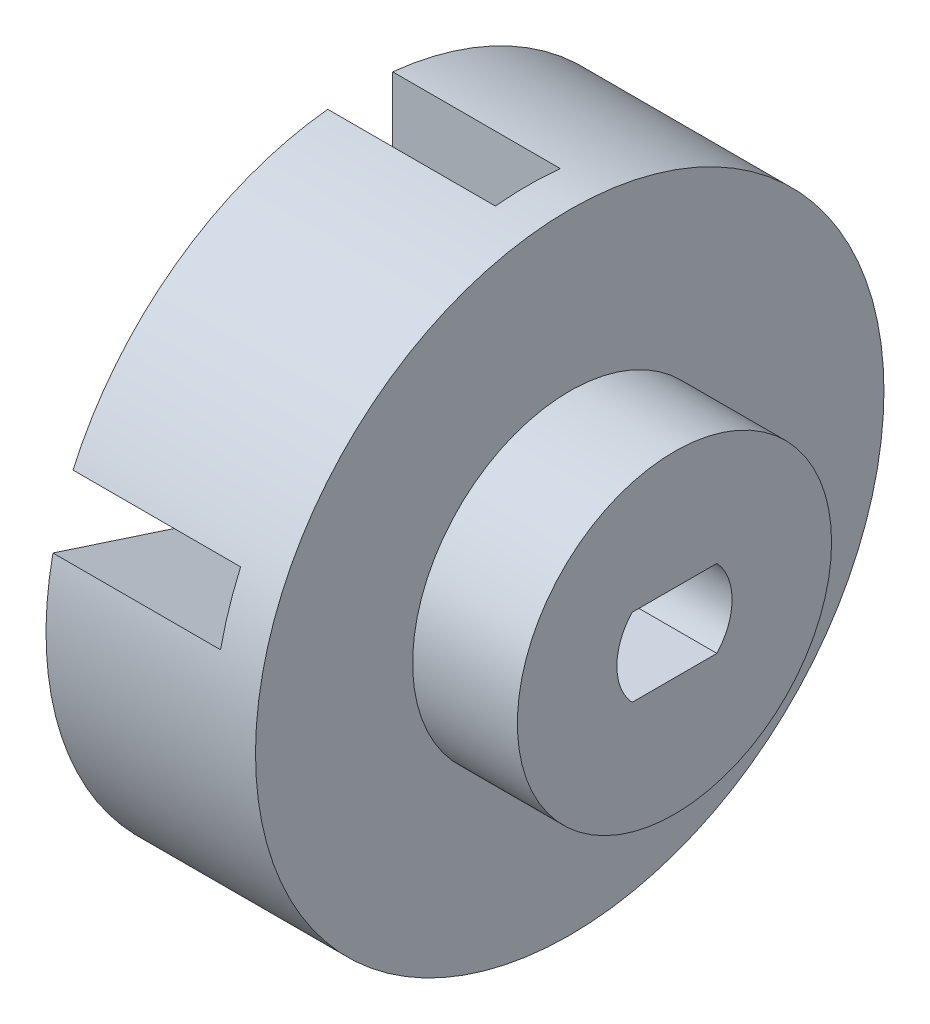
ISO-10303-21;
HEADER;
FILE_DESCRIPTION(('STEP AP214'),'2;1');
FILE_NAME('part.step','',(''),(''),'','','');
FILE_SCHEMA(('AUTOMOTIVE_DESIGN { 1 0 10303 214 1 1 1 1 }'));
ENDSEC;
DATA;
#1=APPLICATION_CONTEXT('core data for automotive mechanical design processes');
#2=APPLICATION_PROTOCOL_DEFINITION('international standard','automotive_design',2000,#1);
#3=PRODUCT_CONTEXT('',#1,'mechanical');
#4=PRODUCT('Part','Part','',(#3));
#5=PRODUCT_RELATED_PRODUCT_CATEGORY('part','',(#4));
#6=PRODUCT_DEFINITION_FORMATION('','',#4);
#7=PRODUCT_DEFINITION_CONTEXT('part definition',#1,'design');
#8=PRODUCT_DEFINITION('design','',#6,#7);
#9=PRODUCT_DEFINITION_SHAPE('','',#8);
#10=(LENGTH_UNIT() NAMED_UNIT(*) SI_UNIT(.MILLI.,.METRE.));
#11=(NAMED_UNIT(*) PLANE_ANGLE_UNIT() SI_UNIT($,.RADIAN.));
#12=(NAMED_UNIT(*) SI_UNIT($,.STERADIAN.) SOLID_ANGLE_UNIT());
#13=UNCERTAINTY_MEASURE_WITH_UNIT(LENGTH_MEASURE(1.E-05),#10,'distance_accuracy_value','');
#14=(GEOMETRIC_REPRESENTATION_CONTEXT(3) GLOBAL_UNCERTAINTY_ASSIGNED_CONTEXT((#13)) GLOBAL_UNIT_ASSIGNED_CONTEXT((#10,
#11,#12)) REPRESENTATION_CONTEXT('',''));
#15=CARTESIAN_POINT('',(0.,0.,0.));
#16=DIRECTION('',(0.,0.,1.));
#17=DIRECTION('',(1.,0.,0.));
#18=AXIS2_PLACEMENT_3D('',#15,#16,#17);
#19=CARTESIAN_POINT('',(10.,0.,0.));
#20=DIRECTION('',(-1.,0.,0.));
#21=DIRECTION('',(0.,0.,1.));
#22=AXIS2_PLACEMENT_3D('',#19,#20,#21);
#23=CYLINDRICAL_SURFACE('',#22,15.);
#24=CARTESIAN_POINT('',(0.,0.,0.));
#25=DIRECTION('',(1.,0.,0.));
#26=DIRECTION('',(0.,0.,-1.));
#27=AXIS2_PLACEMENT_3D('',#24,#25,#26);
#28=CIRCLE('',#27,15.);
#29=CARTESIAN_POINT('',(0.,-11.1592251173272,-10.023556992446));
#30=VERTEX_POINT('',#29);
#31=CARTESIAN_POINT('',(0.,3.1363037882978,-14.6684559019519));
#32=VERTEX_POINT('',#31);
#33=EDGE_CURVE('E374',#30,#32,#28,.T.);
#34=ORIENTED_EDGE('',*,*,#33,.T.);
#35=DIRECTION('',(-1.,0.,0.));
#36=VECTOR('',#35,1.);
#37=CARTESIAN_POINT('',(10.,3.1363037882978,-14.6684559019519));
#38=LINE('',#37,#36);
#39=CARTESIAN_POINT('',(8.,3.1363037882978,-14.6684559019519));
#40=VERTEX_POINT('',#39);
#41=EDGE_CURVE('E326',#32,#40,#38,.F.);
#42=ORIENTED_EDGE('',*,*,#41,.T.);
#43=CARTESIAN_POINT('',(8.,0.,0.));
#44=DIRECTION('',(1.,0.,0.));
#45=DIRECTION('',(0.,0.,-1.));
#46=AXIS2_PLACEMENT_3D('',#43,#44,#45);
#47=CIRCLE('',#46,15.);
#48=CARTESIAN_POINT('',(8.,6.08457898881283,-13.7105032193898));
#49=VERTEX_POINT('',#48);
#50=EDGE_CURVE('E11',#40,#49,#47,.T.);
#51=ORIENTED_EDGE('',*,*,#50,.T.);
#52=DIRECTION('',(-1.,0.,0.));
#53=VECTOR('',#52,1.);
#54=CARTESIAN_POINT('',(10.,6.08457898881283,-13.7105032193898));
#55=LINE('',#54,#53);
#56=CARTESIAN_POINT('',(0.,6.08457898881283,-13.7105032193898));
#57=VERTEX_POINT('',#56);
#58=EDGE_CURVE('E323',#49,#57,#55,.T.);
#59=ORIENTED_EDGE('',*,*,#58,.T.);
#60=CARTESIAN_POINT('',(0.,14.9197017396461,-1.55));
#61=VERTEX_POINT('',#60);
#62=EDGE_CURVE('E381',#57,#61,#28,.T.);
#63=ORIENTED_EDGE('',*,*,#62,.T.);
#64=DIRECTION('',(-1.,0.,0.));
#65=VECTOR('',#64,1.);
#66=CARTESIAN_POINT('',(10.,14.9197017396461,-1.55));
#67=LINE('',#66,#65);
#68=CARTESIAN_POINT('',(8.,14.9197017396461,-1.55));
#69=VERTEX_POINT('',#68);
#70=EDGE_CURVE('E299',#61,#69,#67,.F.);
#71=ORIENTED_EDGE('',*,*,#70,.T.);
#72=CARTESIAN_POINT('',(8.,0.,0.));
#73=DIRECTION('',(-1.,0.,0.));
#74=DIRECTION('',(0.,0.,1.));
#75=AXIS2_PLACEMENT_3D('',#72,#73,#74);
#76=CIRCLE('',#75,15.);
#77=CARTESIAN_POINT('',(8.,14.9197017396461,1.55));
#78=VERTEX_POINT('',#77);
#79=EDGE_CURVE('E397',#78,#69,#76,.T.);
#80=ORIENTED_EDGE('',*,*,#79,.F.);
#81=DIRECTION('',(-1.,0.,0.));
#82=VECTOR('',#81,1.);
#83=CARTESIAN_POINT('',(10.,14.9197017396461,1.55));
#84=LINE('',#83,#82);
#85=CARTESIAN_POINT('',(0.,14.9197017396461,1.55));
#86=VERTEX_POINT('',#85);
#87=EDGE_CURVE('E304',#78,#86,#84,.T.);
#88=ORIENTED_EDGE('',*,*,#87,.T.);
#89=CARTESIAN_POINT('',(0.,6.08457898881418,13.7105032193892));
#90=VERTEX_POINT('',#89);
#91=EDGE_CURVE('E435',#86,#90,#28,.T.);
#92=ORIENTED_EDGE('',*,*,#91,.T.);
#93=DIRECTION('',(-1.,0.,0.));
#94=VECTOR('',#93,1.);
#95=CARTESIAN_POINT('',(10.,6.08457898881418,13.7105032193892));
#96=LINE('',#95,#94);
#97=CARTESIAN_POINT('',(8.,6.08457898881418,13.7105032193892));
#98=VERTEX_POINT('',#97);
#99=EDGE_CURVE('E206',#90,#98,#96,.F.);
#100=ORIENTED_EDGE('',*,*,#99,.T.);
#101=CARTESIAN_POINT('',(8.,0.,0.));
#102=DIRECTION('',(1.,0.,0.));
#103=DIRECTION('',(0.,0.,-1.));
#104=AXIS2_PLACEMENT_3D('',#101,#102,#103);
#105=CIRCLE('',#104,15.);
#106=CARTESIAN_POINT('',(8.,3.13630378829924,14.6684559019516));
#107=VERTEX_POINT('',#106);
#108=EDGE_CURVE('E399',#98,#107,#105,.T.);
#109=ORIENTED_EDGE('',*,*,#108,.T.);
#110=DIRECTION('',(-1.,0.,0.));
#111=VECTOR('',#110,1.);
#112=CARTESIAN_POINT('',(10.,3.13630378829924,14.6684559019516));
#113=LINE('',#112,#111);
#114=CARTESIAN_POINT('',(0.,3.13630378829924,14.6684559019516));
#115=VERTEX_POINT('',#114);
#116=EDGE_CURVE('E307',#107,#115,#113,.T.);
#117=ORIENTED_EDGE('',*,*,#116,.T.);
#118=CARTESIAN_POINT('',(0.,-11.1592251173246,10.0235569924489));
#119=VERTEX_POINT('',#118);
#120=EDGE_CURVE('E436',#115,#119,#28,.T.);
#121=ORIENTED_EDGE('',*,*,#120,.T.);
#122=DIRECTION('',(-1.,0.,0.));
#123=VECTOR('',#122,1.);
#124=CARTESIAN_POINT('',(10.,-11.1592251173246,10.0235569924489));
#125=LINE('',#124,#123);
#126=CARTESIAN_POINT('',(8.,-11.1592251173246,10.0235569924489));
#127=VERTEX_POINT('',#126);
#128=EDGE_CURVE('E314',#119,#127,#125,.F.);
#129=ORIENTED_EDGE('',*,*,#128,.T.);
#130=CARTESIAN_POINT('',(8.,0.,0.));
#131=DIRECTION('',(1.,0.,0.));
#132=DIRECTION('',(0.,0.,-1.));
#133=AXIS2_PLACEMENT_3D('',#130,#131,#132);
#134=CIRCLE('',#133,15.);
#135=CARTESIAN_POINT('',(8.,-12.9813593994316,7.5156043098868));
#136=VERTEX_POINT('',#135);
#137=EDGE_CURVE('E402',#127,#136,#134,.T.);
#138=ORIENTED_EDGE('',*,*,#137,.T.);
#139=DIRECTION('',(-1.,0.,0.));
#140=VECTOR('',#139,1.);
#141=CARTESIAN_POINT('',(10.,-12.9813593994316,7.5156043098868));
#142=LINE('',#141,#140);
#143=CARTESIAN_POINT('',(0.,-12.9813593994316,7.5156043098868));
#144=VERTEX_POINT('',#143);
#145=EDGE_CURVE('E311',#136,#144,#142,.T.);
#146=ORIENTED_EDGE('',*,*,#145,.T.);
#147=CARTESIAN_POINT('',(0.,-12.9813593994335,-7.51560430988345));
#148=VERTEX_POINT('',#147);
#149=EDGE_CURVE('E384',#144,#148,#28,.T.);
#150=ORIENTED_EDGE('',*,*,#149,.T.);
#151=DIRECTION('',(-1.,0.,0.));
#152=VECTOR('',#151,1.);
#153=CARTESIAN_POINT('',(10.,-12.9813593994335,-7.51560430988345));
#154=LINE('',#153,#152);
#155=CARTESIAN_POINT('',(8.,-12.9813593994335,-7.51560430988345));
#156=VERTEX_POINT('',#155);
#157=EDGE_CURVE('E320',#148,#156,#154,.F.);
#158=ORIENTED_EDGE('',*,*,#157,.T.);
#159=CARTESIAN_POINT('',(8.,0.,0.));
#160=DIRECTION('',(1.,0.,0.));
#161=DIRECTION('',(0.,0.,-1.));
#162=AXIS2_PLACEMENT_3D('',#159,#160,#161);
#163=CIRCLE('',#162,15.);
#164=CARTESIAN_POINT('',(8.,-11.1592251173272,-10.023556992446));
#165=VERTEX_POINT('',#164);
#166=EDGE_CURVE('E44',#156,#165,#163,.T.);
#167=ORIENTED_EDGE('',*,*,#166,.T.);
#168=DIRECTION('',(-1.,0.,0.));
#169=VECTOR('',#168,1.);
#170=CARTESIAN_POINT('',(10.,-11.1592251173272,-10.023556992446));
#171=LINE('',#170,#169);
#172=EDGE_CURVE('E317',#165,#30,#171,.T.);
#173=ORIENTED_EDGE('',*,*,#172,.T.);
#174=EDGE_LOOP('',(#34,#42,#51,#59,#63,#71,#80,#88,#92,#100,#109,#117,#121,#129,#138,#146,#150,
#158,#167,#173));
#175=FACE_BOUND('',#174,.T.);
#176=CARTESIAN_POINT('',(10.,0.,0.));
#177=DIRECTION('',(1.,0.,0.));
#178=DIRECTION('',(0.,0.,-1.));
#179=AXIS2_PLACEMENT_3D('',#176,#177,#178);
#180=CIRCLE('',#179,15.);
#181=CARTESIAN_POINT('',(10.,0.,-15.));
#182=VERTEX_POINT('',#181);
#183=EDGE_CURVE('E378',#182,#182,#180,.T.);
#184=ORIENTED_EDGE('',*,*,#183,.F.);
#185=EDGE_LOOP('',(#184));
#186=FACE_BOUND('',#185,.T.);
#187=ADVANCED_FACE('F37',(#175,#186),#23,.T.);
#188=CARTESIAN_POINT('',(10.,0.,0.));
#189=DIRECTION('',(1.,0.,0.));
#190=DIRECTION('',(0.,0.,-1.));
#191=AXIS2_PLACEMENT_3D('',#188,#189,#190);
#192=PLANE('',#191);
#193=CARTESIAN_POINT('',(10.,0.,0.));
#194=DIRECTION('',(1.,0.,0.));
#195=DIRECTION('',(0.,0.,-1.));
#196=AXIS2_PLACEMENT_3D('',#193,#194,#195);
#197=CIRCLE('',#196,7.5);
#198=CARTESIAN_POINT('',(10.,0.,-7.5));
#199=VERTEX_POINT('',#198);
#200=EDGE_CURVE('E375',#199,#199,#197,.T.);
#201=ORIENTED_EDGE('',*,*,#200,.F.);
#202=EDGE_LOOP('',(#201));
#203=FACE_BOUND('',#202,.T.);
#204=ORIENTED_EDGE('',*,*,#183,.T.);
#205=EDGE_LOOP('',(#204));
#206=FACE_BOUND('',#205,.T.);
#207=ADVANCED_FACE('F464',(#203,#206),#192,.T.);
#208=CARTESIAN_POINT('',(0.,0.,0.));
#209=DIRECTION('',(1.,0.,0.));
#210=DIRECTION('',(0.,0.,-1.));
#211=AXIS2_PLACEMENT_3D('',#208,#209,#210);
#212=PLANE('',#211);
#213=CARTESIAN_POINT('',(0.,0.,0.));
#214=DIRECTION('',(-1.,0.,0.));
#215=DIRECTION('',(0.,0.,1.));
#216=AXIS2_PLACEMENT_3D('',#213,#214,#215);
#217=CIRCLE('',#216,2.7);
#218=CARTESIAN_POINT('',(0.,0.,2.7));
#219=VERTEX_POINT('',#218);
#220=EDGE_CURVE('E337',#219,#219,#217,.T.);
#221=ORIENTED_EDGE('',*,*,#220,.F.);
#222=EDGE_LOOP('',(#221));
#223=FACE_BOUND('',#222,.T.);
#224=DIRECTION('',(0.,0.951056516295154,0.309016994374947));
#225=VECTOR('',#224,1.);
#226=CARTESIAN_POINT('',(0.,0.0709473716161586,-5.23425892275631));
#227=LINE('',#226,#225);
#228=CARTESIAN_POINT('',(0.,0.0709473716161586,-5.23425892275631));
#229=VERTEX_POINT('',#228);
#230=CARTESIAN_POINT('',(0.,3.01922257213113,-4.27630624019398));
#231=VERTEX_POINT('',#230);
#232=EDGE_CURVE('E51',#229,#231,#227,.T.);
#233=ORIENTED_EDGE('',*,*,#232,.F.);
#234=DIRECTION('',(0.,0.309016994374947,-0.951056516295154));
#235=VECTOR('',#234,1.);
#236=CARTESIAN_POINT('',(0.,-1.47413760025829,-0.478976341281428));
#237=LINE('',#236,#235);
#238=EDGE_CURVE('E394',#229,#32,#237,.T.);
#239=ORIENTED_EDGE('',*,*,#238,.T.);
#240=ORIENTED_EDGE('',*,*,#33,.F.);
#241=DIRECTION('',(0.,-0.809016994374948,-0.587785252292473));
#242=VECTOR('',#241,1.);
#243=CARTESIAN_POINT('',(0.,-15.2620026854318,-13.0043993786205));
#244=LINE('',#243,#242);
#245=CARTESIAN_POINT('',(0.,-3.13401783082224,-4.19290260274169));
#246=VERTEX_POINT('',#245);
#247=EDGE_CURVE('E261',#246,#30,#244,.T.);
#248=ORIENTED_EDGE('',*,*,#247,.F.);
#249=DIRECTION('',(0.,0.587785252292473,-0.809016994374947));
#250=VECTOR('',#249,1.);
#251=CARTESIAN_POINT('',(0.,-4.95615211292891,-1.68494992017935));
#252=LINE('',#251,#250);
#253=CARTESIAN_POINT('',(0.,-4.95615211292891,-1.68494992017935));
#254=VERTEX_POINT('',#253);
#255=EDGE_CURVE('E59',#254,#246,#252,.T.);
#256=ORIENTED_EDGE('',*,*,#255,.F.);
#257=DIRECTION('',(0.,-0.809016994374948,-0.587785252292473));
#258=VECTOR('',#257,1.);
#259=CARTESIAN_POINT('',(0.,-0.911067141054503,1.25397634128278));
#260=LINE('',#259,#258);
#261=EDGE_CURVE('E391',#254,#148,#260,.T.);
#262=ORIENTED_EDGE('',*,*,#261,.T.);
#263=ORIENTED_EDGE('',*,*,#149,.F.);
#264=DIRECTION('',(0.,-0.809016994374947,0.587785252292473));
#265=VECTOR('',#264,1.);
#266=CARTESIAN_POINT('',(0.,-17.0841369675372,10.496446696062));
#267=LINE('',#266,#265);
#268=CARTESIAN_POINT('',(0.,-4.95615211292767,1.68494992018319));
#269=VERTEX_POINT('',#268);
#270=EDGE_CURVE('E246',#269,#144,#267,.T.);
#271=ORIENTED_EDGE('',*,*,#270,.F.);
#272=DIRECTION('',(0.,-0.587785252292473,-0.809016994374947));
#273=VECTOR('',#272,1.);
#274=CARTESIAN_POINT('',(0.,-3.134017830821,4.19290260274553));
#275=LINE('',#274,#273);
#276=CARTESIAN_POINT('',(0.,-3.134017830821,4.19290260274553));
#277=VERTEX_POINT('',#276);
#278=EDGE_CURVE('E221',#277,#269,#275,.T.);
#279=ORIENTED_EDGE('',*,*,#278,.F.);
#280=DIRECTION('',(0.,-0.809016994374947,0.587785252292473));
#281=VECTOR('',#280,1.);
#282=CARTESIAN_POINT('',(0.,0.911067141054419,1.25397634128266));
#283=LINE('',#282,#281);
#284=EDGE_CURVE('E211',#277,#119,#283,.T.);
#285=ORIENTED_EDGE('',*,*,#284,.T.);
#286=ORIENTED_EDGE('',*,*,#120,.F.);
#287=DIRECTION('',(0.,0.309016994374948,0.951056516295154));
#288=VECTOR('',#287,1.);
#289=CARTESIAN_POINT('',(0.,4.70342537103509,19.4915601978898));
#290=LINE('',#289,#288);
#291=CARTESIAN_POINT('',(0.,0.070947371618174,5.23425892275779));
#292=VERTEX_POINT('',#291);
#293=EDGE_CURVE('E226',#292,#115,#290,.T.);
#294=ORIENTED_EDGE('',*,*,#293,.F.);
#295=DIRECTION('',(0.,-0.951056516295154,0.309016994374947));
#296=VECTOR('',#295,1.);
#297=CARTESIAN_POINT('',(0.,3.01922257213315,4.27630624019545));
#298=LINE('',#297,#296);
#299=CARTESIAN_POINT('',(0.,3.01922257213315,4.27630624019545));
#300=VERTEX_POINT('',#299);
#301=EDGE_CURVE('E216',#300,#292,#298,.T.);
#302=ORIENTED_EDGE('',*,*,#301,.F.);
#303=DIRECTION('',(0.,0.309016994374948,0.951056516295154));
#304=VECTOR('',#303,1.);
#305=CARTESIAN_POINT('',(0.,1.47413760025807,-0.478976341281359));
#306=LINE('',#305,#304);
#307=EDGE_CURVE('E199',#300,#90,#306,.T.);
#308=ORIENTED_EDGE('',*,*,#307,.T.);
#309=ORIENTED_EDGE('',*,*,#91,.F.);
#310=DIRECTION('',(0.,1.,0.));
#311=VECTOR('',#310,1.);
#312=CARTESIAN_POINT('',(0.,19.9910137103853,1.55));
#313=LINE('',#312,#311);
#314=CARTESIAN_POINT('',(0.,5.,1.55));
#315=VERTEX_POINT('',#314);
#316=EDGE_CURVE('E227',#315,#86,#313,.T.);
#317=ORIENTED_EDGE('',*,*,#316,.F.);
#318=DIRECTION('',(0.,0.,1.));
#319=VECTOR('',#318,1.);
#320=CARTESIAN_POINT('',(0.,5.,-1.55));
#321=LINE('',#320,#319);
#322=CARTESIAN_POINT('',(0.,5.,-1.55));
#323=VERTEX_POINT('',#322);
#324=EDGE_CURVE('E229',#323,#315,#321,.T.);
#325=ORIENTED_EDGE('',*,*,#324,.F.);
#326=DIRECTION('',(0.,1.,0.));
#327=VECTOR('',#326,1.);
#328=CARTESIAN_POINT('',(0.,0.,-1.54999999999999));
#329=LINE('',#328,#327);
#330=EDGE_CURVE('E212',#323,#61,#329,.T.);
#331=ORIENTED_EDGE('',*,*,#330,.T.);
#332=ORIENTED_EDGE('',*,*,#62,.F.);
#333=DIRECTION('',(0.,0.309016994374947,-0.951056516295154));
#334=VECTOR('',#333,1.);
#335=CARTESIAN_POINT('',(0.,7.65170057154804,-18.533607515326));
#336=LINE('',#335,#334);
#337=EDGE_CURVE('E276',#231,#57,#336,.T.);
#338=ORIENTED_EDGE('',*,*,#337,.F.);
#339=EDGE_LOOP('',(#233,#239,#240,#248,#256,#262,#263,#271,#279,#285,#286,#294,#302,#308,#309,
#317,#325,#331,#332,#338));
#340=FACE_BOUND('',#339,.T.);
#341=ADVANCED_FACE('F224',(#223,#340),#212,.F.);
#342=CARTESIAN_POINT('',(15.,0.,0.));
#343=DIRECTION('',(-1.,0.,0.));
#344=DIRECTION('',(0.,0.,1.));
#345=AXIS2_PLACEMENT_3D('',#342,#343,#344);
#346=CYLINDRICAL_SURFACE('',#345,7.5);
#347=CARTESIAN_POINT('',(15.,0.,0.));
#348=DIRECTION('',(1.,0.,0.));
#349=DIRECTION('',(0.,0.,-1.));
#350=AXIS2_PLACEMENT_3D('',#347,#348,#349);
#351=CIRCLE('',#350,7.5);
#352=CARTESIAN_POINT('',(15.,0.,-7.5));
#353=VERTEX_POINT('',#352);
#354=EDGE_CURVE('E365',#353,#353,#351,.T.);
#355=ORIENTED_EDGE('',*,*,#354,.F.);
#356=EDGE_LOOP('',(#355));
#357=FACE_BOUND('',#356,.T.);
#358=ORIENTED_EDGE('',*,*,#200,.T.);
#359=EDGE_LOOP('',(#358));
#360=FACE_BOUND('',#359,.T.);
#361=ADVANCED_FACE('F473',(#357,#360),#346,.T.);
#362=CARTESIAN_POINT('',(15.,0.,0.));
#363=DIRECTION('',(1.,0.,0.));
#364=DIRECTION('',(0.,0.,-1.));
#365=AXIS2_PLACEMENT_3D('',#362,#363,#364);
#366=PLANE('',#365);
#367=CARTESIAN_POINT('',(15.,0.,0.));
#368=DIRECTION('',(1.,0.,0.));
#369=DIRECTION('',(0.,0.,-1.));
#370=AXIS2_PLACEMENT_3D('',#367,#368,#369);
#371=CIRCLE('',#370,2.75);
#372=CARTESIAN_POINT('',(15.,1.86,2.02556165050585));
#373=VERTEX_POINT('',#372);
#374=CARTESIAN_POINT('',(15.,-1.86,2.02556165050585));
#375=VERTEX_POINT('',#374);
#376=EDGE_CURVE('E336',#373,#375,#371,.T.);
#377=ORIENTED_EDGE('',*,*,#376,.F.);
#378=DIRECTION('',(0.,0.,1.));
#379=VECTOR('',#378,1.);
#380=CARTESIAN_POINT('',(15.,1.86,2.02556165050585));
#381=LINE('',#380,#379);
#382=CARTESIAN_POINT('',(15.,1.86,-2.02556165050585));
#383=VERTEX_POINT('',#382);
#384=EDGE_CURVE('E344',#383,#373,#381,.T.);
#385=ORIENTED_EDGE('',*,*,#384,.F.);
#386=CARTESIAN_POINT('',(15.,0.,0.));
#387=DIRECTION('',(1.,0.,0.));
#388=DIRECTION('',(0.,0.,-1.));
#389=AXIS2_PLACEMENT_3D('',#386,#387,#388);
#390=CIRCLE('',#389,2.75);
#391=CARTESIAN_POINT('',(15.,-1.86,-2.02556165050585));
#392=VERTEX_POINT('',#391);
#393=EDGE_CURVE('E358',#392,#383,#390,.T.);
#394=ORIENTED_EDGE('',*,*,#393,.F.);
#395=DIRECTION('',(0.,0.,-1.));
#396=VECTOR('',#395,1.);
#397=CARTESIAN_POINT('',(15.,-1.86,2.02556165050585));
#398=LINE('',#397,#396);
#399=EDGE_CURVE('E355',#375,#392,#398,.T.);
#400=ORIENTED_EDGE('',*,*,#399,.F.);
#401=EDGE_LOOP('',(#377,#385,#394,#400));
#402=FACE_BOUND('',#401,.T.);
#403=ORIENTED_EDGE('',*,*,#354,.T.);
#404=EDGE_LOOP('',(#403));
#405=FACE_BOUND('',#404,.T.);
#406=ADVANCED_FACE('F480',(#402,#405),#366,.T.);
#407=CARTESIAN_POINT('',(10.,0.,0.));
#408=DIRECTION('',(1.,0.,0.));
#409=DIRECTION('',(0.,0.,-1.));
#410=AXIS2_PLACEMENT_3D('',#407,#408,#409);
#411=CYLINDRICAL_SURFACE('',#410,2.75);
#412=ORIENTED_EDGE('',*,*,#376,.T.);
#413=DIRECTION('',(1.,0.,0.));
#414=VECTOR('',#413,1.);
#415=CARTESIAN_POINT('',(10.,-1.86,2.02556165050585));
#416=LINE('',#415,#414);
#417=CARTESIAN_POINT('',(10.,-1.86,2.02556165050585));
#418=VERTEX_POINT('',#417);
#419=EDGE_CURVE('E353',#418,#375,#416,.T.);
#420=ORIENTED_EDGE('',*,*,#419,.F.);
#421=CARTESIAN_POINT('',(10.,0.,0.));
#422=DIRECTION('',(1.,0.,0.));
#423=DIRECTION('',(0.,0.,-1.));
#424=AXIS2_PLACEMENT_3D('',#421,#422,#423);
#425=CIRCLE('',#424,2.75);
#426=CARTESIAN_POINT('',(10.,1.86,2.02556165050585));
#427=VERTEX_POINT('',#426);
#428=EDGE_CURVE('E340',#427,#418,#425,.T.);
#429=ORIENTED_EDGE('',*,*,#428,.F.);
#430=DIRECTION('',(1.,0.,0.));
#431=VECTOR('',#430,1.);
#432=CARTESIAN_POINT('',(10.,1.86,2.02556165050585));
#433=LINE('',#432,#431);
#434=EDGE_CURVE('E363',#427,#373,#433,.T.);
#435=ORIENTED_EDGE('',*,*,#434,.T.);
#436=EDGE_LOOP('',(#412,#420,#429,#435));
#437=FACE_BOUND('',#436,.T.);
#438=ADVANCED_FACE('F484',(#437),#411,.F.);
#439=CARTESIAN_POINT('',(10.,1.86,2.02556165050585));
#440=DIRECTION('',(0.,1.,0.));
#441=DIRECTION('',(0.,0.,1.));
#442=AXIS2_PLACEMENT_3D('',#439,#440,#441);
#443=PLANE('',#442);
#444=ORIENTED_EDGE('',*,*,#384,.T.);
#445=ORIENTED_EDGE('',*,*,#434,.F.);
#446=DIRECTION('',(0.,0.,1.));
#447=VECTOR('',#446,1.);
#448=CARTESIAN_POINT('',(10.,1.86,2.02556165050585));
#449=LINE('',#448,#447);
#450=CARTESIAN_POINT('',(10.,1.86,-2.02556165050585));
#451=VERTEX_POINT('',#450);
#452=EDGE_CURVE('E350',#451,#427,#449,.T.);
#453=ORIENTED_EDGE('',*,*,#452,.F.);
#454=DIRECTION('',(1.,0.,0.));
#455=VECTOR('',#454,1.);
#456=CARTESIAN_POINT('',(10.,1.86,-2.02556165050585));
#457=LINE('',#456,#455);
#458=EDGE_CURVE('E366',#451,#383,#457,.T.);
#459=ORIENTED_EDGE('',*,*,#458,.T.);
#460=EDGE_LOOP('',(#444,#445,#453,#459));
#461=FACE_BOUND('',#460,.T.);
#462=ADVANCED_FACE('F488',(#461),#443,.F.);
#463=CARTESIAN_POINT('',(10.,0.,0.));
#464=DIRECTION('',(1.,0.,0.));
#465=DIRECTION('',(0.,0.,-1.));
#466=AXIS2_PLACEMENT_3D('',#463,#464,#465);
#467=CYLINDRICAL_SURFACE('',#466,2.75);
#468=ORIENTED_EDGE('',*,*,#393,.T.);
#469=ORIENTED_EDGE('',*,*,#458,.F.);
#470=CARTESIAN_POINT('',(10.,0.,0.));
#471=DIRECTION('',(1.,0.,0.));
#472=DIRECTION('',(0.,0.,-1.));
#473=AXIS2_PLACEMENT_3D('',#470,#471,#472);
#474=CIRCLE('',#473,2.75);
#475=CARTESIAN_POINT('',(10.,-1.86,-2.02556165050585));
#476=VERTEX_POINT('',#475);
#477=EDGE_CURVE('E347',#476,#451,#474,.T.);
#478=ORIENTED_EDGE('',*,*,#477,.F.);
#479=DIRECTION('',(1.,0.,0.));
#480=VECTOR('',#479,1.);
#481=CARTESIAN_POINT('',(10.,-1.86,-2.02556165050585));
#482=LINE('',#481,#480);
#483=EDGE_CURVE('E368',#476,#392,#482,.T.);
#484=ORIENTED_EDGE('',*,*,#483,.T.);
#485=EDGE_LOOP('',(#468,#469,#478,#484));
#486=FACE_BOUND('',#485,.T.);
#487=ADVANCED_FACE('F494',(#486),#467,.F.);
#488=CARTESIAN_POINT('',(10.,-1.86,2.02556165050585));
#489=DIRECTION('',(0.,-1.,0.));
#490=DIRECTION('',(0.,0.,-1.));
#491=AXIS2_PLACEMENT_3D('',#488,#489,#490);
#492=PLANE('',#491);
#493=ORIENTED_EDGE('',*,*,#399,.T.);
#494=ORIENTED_EDGE('',*,*,#483,.F.);
#495=DIRECTION('',(0.,0.,-1.));
#496=VECTOR('',#495,1.);
#497=CARTESIAN_POINT('',(10.,-1.86,2.02556165050585));
#498=LINE('',#497,#496);
#499=EDGE_CURVE('E343',#418,#476,#498,.T.);
#500=ORIENTED_EDGE('',*,*,#499,.F.);
#501=ORIENTED_EDGE('',*,*,#419,.T.);
#502=EDGE_LOOP('',(#493,#494,#500,#501));
#503=FACE_BOUND('',#502,.T.);
#504=ADVANCED_FACE('F490',(#503),#492,.F.);
#505=CARTESIAN_POINT('',(10.,0.,0.));
#506=DIRECTION('',(1.,0.,0.));
#507=DIRECTION('',(0.,0.,-1.));
#508=AXIS2_PLACEMENT_3D('',#505,#506,#507);
#509=PLANE('',#508);
#510=CARTESIAN_POINT('',(10.,0.,0.));
#511=DIRECTION('',(1.,0.,0.));
#512=DIRECTION('',(0.,0.,-1.));
#513=AXIS2_PLACEMENT_3D('',#510,#511,#512);
#514=CIRCLE('',#513,1.05);
#515=CARTESIAN_POINT('',(10.,0.,-1.05));
#516=VERTEX_POINT('',#515);
#517=EDGE_CURVE('E332',#516,#516,#514,.T.);
#518=ORIENTED_EDGE('',*,*,#517,.F.);
#519=EDGE_LOOP('',(#518));
#520=FACE_BOUND('',#519,.T.);
#521=ORIENTED_EDGE('',*,*,#428,.T.);
#522=ORIENTED_EDGE('',*,*,#499,.T.);
#523=ORIENTED_EDGE('',*,*,#477,.T.);
#524=ORIENTED_EDGE('',*,*,#452,.T.);
#525=EDGE_LOOP('',(#521,#522,#523,#524));
#526=FACE_BOUND('',#525,.T.);
#527=ADVANCED_FACE('F493',(#520,#526),#509,.T.);
#528=CARTESIAN_POINT('',(5.,0.,0.));
#529=DIRECTION('',(-1.,0.,0.));
#530=DIRECTION('',(0.,0.,1.));
#531=AXIS2_PLACEMENT_3D('',#528,#529,#530);
#532=CYLINDRICAL_SURFACE('',#531,2.7);
#533=CARTESIAN_POINT('',(5.,0.,0.));
#534=DIRECTION('',(-1.,0.,0.));
#535=DIRECTION('',(0.,0.,1.));
#536=AXIS2_PLACEMENT_3D('',#533,#534,#535);
#537=CIRCLE('',#536,2.7);
#538=CARTESIAN_POINT('',(5.,0.,2.7));
#539=VERTEX_POINT('',#538);
#540=EDGE_CURVE('E333',#539,#539,#537,.T.);
#541=ORIENTED_EDGE('',*,*,#540,.F.);
#542=EDGE_LOOP('',(#541));
#543=FACE_BOUND('',#542,.T.);
#544=ORIENTED_EDGE('',*,*,#220,.T.);
#545=EDGE_LOOP('',(#544));
#546=FACE_BOUND('',#545,.T.);
#547=ADVANCED_FACE('F504',(#543,#546),#532,.F.);
#548=CARTESIAN_POINT('',(5.,0.,0.));
#549=DIRECTION('',(-1.,0.,0.));
#550=DIRECTION('',(0.,0.,1.));
#551=AXIS2_PLACEMENT_3D('',#548,#549,#550);
#552=PLANE('',#551);
#553=CARTESIAN_POINT('',(5.,0.,0.));
#554=DIRECTION('',(-1.,0.,0.));
#555=DIRECTION('',(0.,0.,1.));
#556=AXIS2_PLACEMENT_3D('',#553,#554,#555);
#557=CIRCLE('',#556,1.05);
#558=CARTESIAN_POINT('',(5.,0.,1.05));
#559=VERTEX_POINT('',#558);
#560=EDGE_CURVE('E329',#559,#559,#557,.T.);
#561=ORIENTED_EDGE('',*,*,#560,.F.);
#562=EDGE_LOOP('',(#561));
#563=FACE_BOUND('',#562,.T.);
#564=ORIENTED_EDGE('',*,*,#540,.T.);
#565=EDGE_LOOP('',(#564));
#566=FACE_BOUND('',#565,.T.);
#567=ADVANCED_FACE('F508',(#563,#566),#552,.T.);
#568=CARTESIAN_POINT('',(15.,0.,0.));
#569=DIRECTION('',(-1.,0.,0.));
#570=DIRECTION('',(0.,0.,1.));
#571=AXIS2_PLACEMENT_3D('',#568,#569,#570);
#572=CYLINDRICAL_SURFACE('',#571,1.05);
#573=ORIENTED_EDGE('',*,*,#517,.T.);
#574=EDGE_LOOP('',(#573));
#575=FACE_BOUND('',#574,.T.);
#576=ORIENTED_EDGE('',*,*,#560,.T.);
#577=EDGE_LOOP('',(#576));
#578=FACE_BOUND('',#577,.T.);
#579=ADVANCED_FACE('F512',(#575,#578),#572,.F.);
#580=CARTESIAN_POINT('',(8.,0.,0.));
#581=DIRECTION('',(-1.,0.,0.));
#582=DIRECTION('',(0.,0.,1.));
#583=AXIS2_PLACEMENT_3D('',#580,#581,#582);
#584=PLANE('',#583);
#585=ORIENTED_EDGE('',*,*,#79,.T.);
#586=DIRECTION('',(0.,-1.,0.));
#587=VECTOR('',#586,1.);
#588=CARTESIAN_POINT('',(8.,19.9910137103853,-1.55));
#589=LINE('',#588,#587);
#590=CARTESIAN_POINT('',(8.,5.,-1.55));
#591=VERTEX_POINT('',#590);
#592=EDGE_CURVE('E289',#69,#591,#589,.T.);
#593=ORIENTED_EDGE('',*,*,#592,.T.);
#594=DIRECTION('',(0.,0.,1.));
#595=VECTOR('',#594,1.);
#596=CARTESIAN_POINT('',(8.,5.,-1.55));
#597=LINE('',#596,#595);
#598=CARTESIAN_POINT('',(8.,5.,1.55));
#599=VERTEX_POINT('',#598);
#600=EDGE_CURVE('E291',#591,#599,#597,.T.);
#601=ORIENTED_EDGE('',*,*,#600,.T.);
#602=DIRECTION('',(0.,1.,0.));
#603=VECTOR('',#602,1.);
#604=CARTESIAN_POINT('',(8.,19.9910137103853,1.55));
#605=LINE('',#604,#603);
#606=EDGE_CURVE('E286',#599,#78,#605,.T.);
#607=ORIENTED_EDGE('',*,*,#606,.T.);
#608=EDGE_LOOP('',(#585,#593,#601,#607));
#609=FACE_BOUND('',#608,.T.);
#610=ADVANCED_FACE('F516',(#609),#584,.T.);
#611=CARTESIAN_POINT('',(8.,19.9910137103853,1.55));
#612=DIRECTION('',(0.,0.,1.));
#613=DIRECTION('',(0.,-1.,0.));
#614=AXIS2_PLACEMENT_3D('',#611,#612,#613);
#615=PLANE('',#614);
#616=ORIENTED_EDGE('',*,*,#606,.F.);
#617=DIRECTION('',(-1.,0.,0.));
#618=VECTOR('',#617,1.);
#619=CARTESIAN_POINT('',(8.,5.,1.55));
#620=LINE('',#619,#618);
#621=EDGE_CURVE('E297',#599,#315,#620,.T.);
#622=ORIENTED_EDGE('',*,*,#621,.T.);
#623=ORIENTED_EDGE('',*,*,#316,.T.);
#624=ORIENTED_EDGE('',*,*,#87,.F.);
#625=EDGE_LOOP('',(#616,#622,#623,#624));
#626=FACE_BOUND('',#625,.T.);
#627=ADVANCED_FACE('F518',(#626),#615,.F.);
#628=CARTESIAN_POINT('',(8.,19.9910137103853,-1.55));
#629=DIRECTION('',(0.,0.,-1.));
#630=DIRECTION('',(0.,1.,0.));
#631=AXIS2_PLACEMENT_3D('',#628,#629,#630);
#632=PLANE('',#631);
#633=ORIENTED_EDGE('',*,*,#330,.F.);
#634=DIRECTION('',(-1.,0.,0.));
#635=VECTOR('',#634,1.);
#636=CARTESIAN_POINT('',(8.,5.,-1.55));
#637=LINE('',#636,#635);
#638=EDGE_CURVE('E293',#591,#323,#637,.T.);
#639=ORIENTED_EDGE('',*,*,#638,.F.);
#640=ORIENTED_EDGE('',*,*,#592,.F.);
#641=ORIENTED_EDGE('',*,*,#70,.F.);
#642=EDGE_LOOP('',(#633,#639,#640,#641));
#643=FACE_BOUND('',#642,.T.);
#644=ADVANCED_FACE('F521',(#643),#632,.F.);
#645=CARTESIAN_POINT('',(8.,5.,-1.55));
#646=DIRECTION('',(0.,-1.,0.));
#647=DIRECTION('',(0.,0.,-1.));
#648=AXIS2_PLACEMENT_3D('',#645,#646,#647);
#649=PLANE('',#648);
#650=ORIENTED_EDGE('',*,*,#324,.T.);
#651=ORIENTED_EDGE('',*,*,#621,.F.);
#652=ORIENTED_EDGE('',*,*,#600,.F.);
#653=ORIENTED_EDGE('',*,*,#638,.T.);
#654=EDGE_LOOP('',(#650,#651,#652,#653));
#655=FACE_BOUND('',#654,.T.);
#656=ADVANCED_FACE('F525',(#655),#649,.F.);
#657=CARTESIAN_POINT('',(8.,0.,0.));
#658=DIRECTION('',(1.,0.,0.));
#659=DIRECTION('',(0.,0.,-1.));
#660=AXIS2_PLACEMENT_3D('',#657,#658,#659);
#661=PLANE('',#660);
#662=DIRECTION('',(0.,-0.309016994374948,-0.951056516295153));
#663=VECTOR('',#662,1.);
#664=CARTESIAN_POINT('',(8.,7.65170057155006,18.5336075153274));
#665=LINE('',#664,#663);
#666=CARTESIAN_POINT('',(8.,3.01922257213315,4.27630624019545));
#667=VERTEX_POINT('',#666);
#668=EDGE_CURVE('E233',#98,#667,#665,.T.);
#669=ORIENTED_EDGE('',*,*,#668,.T.);
#670=DIRECTION('',(0.,-0.951056516295154,0.309016994374947));
#671=VECTOR('',#670,1.);
#672=CARTESIAN_POINT('',(8.,3.01922257213315,4.27630624019545));
#673=LINE('',#672,#671);
#674=CARTESIAN_POINT('',(8.,0.0709473716181739,5.23425892275779));
#675=VERTEX_POINT('',#674);
#676=EDGE_CURVE('E219',#667,#675,#673,.T.);
#677=ORIENTED_EDGE('',*,*,#676,.T.);
#678=DIRECTION('',(0.,0.309016994374948,0.951056516295154));
#679=VECTOR('',#678,1.);
#680=CARTESIAN_POINT('',(8.,4.70342537103509,19.4915601978898));
#681=LINE('',#680,#679);
#682=EDGE_CURVE('E235',#675,#107,#681,.T.);
#683=ORIENTED_EDGE('',*,*,#682,.T.);
#684=ORIENTED_EDGE('',*,*,#108,.F.);
#685=EDGE_LOOP('',(#669,#677,#683,#684));
#686=FACE_BOUND('',#685,.T.);
#687=ADVANCED_FACE('F529',(#686),#661,.F.);
#688=CARTESIAN_POINT('',(8.,7.65170057155006,18.5336075153274));
#689=DIRECTION('',(0.,0.951056516295154,-0.309016994374948));
#690=DIRECTION('',(0.,0.309016994374948,0.951056516295154));
#691=AXIS2_PLACEMENT_3D('',#688,#689,#690);
#692=PLANE('',#691);
#693=ORIENTED_EDGE('',*,*,#307,.F.);
#694=DIRECTION('',(-1.,0.,0.));
#695=VECTOR('',#694,1.);
#696=CARTESIAN_POINT('',(8.,3.01922257213315,4.27630624019545));
#697=LINE('',#696,#695);
#698=EDGE_CURVE('E203',#667,#300,#697,.T.);
#699=ORIENTED_EDGE('',*,*,#698,.F.);
#700=ORIENTED_EDGE('',*,*,#668,.F.);
#701=ORIENTED_EDGE('',*,*,#99,.F.);
#702=EDGE_LOOP('',(#693,#699,#700,#701));
#703=FACE_BOUND('',#702,.T.);
#704=ADVANCED_FACE('F201',(#703),#692,.F.);
#705=CARTESIAN_POINT('',(8.,4.70342537103509,19.4915601978898));
#706=DIRECTION('',(0.,-0.951056516295154,0.309016994374948));
#707=DIRECTION('',(0.,-0.309016994374948,-0.951056516295154));
#708=AXIS2_PLACEMENT_3D('',#705,#706,#707);
#709=PLANE('',#708);
#710=ORIENTED_EDGE('',*,*,#682,.F.);
#711=DIRECTION('',(-1.,0.,0.));
#712=VECTOR('',#711,1.);
#713=CARTESIAN_POINT('',(8.,0.0709473716181739,5.23425892275779));
#714=LINE('',#713,#712);
#715=EDGE_CURVE('E220',#675,#292,#714,.T.);
#716=ORIENTED_EDGE('',*,*,#715,.T.);
#717=ORIENTED_EDGE('',*,*,#293,.T.);
#718=ORIENTED_EDGE('',*,*,#116,.F.);
#719=EDGE_LOOP('',(#710,#716,#717,#718));
#720=FACE_BOUND('',#719,.T.);
#721=ADVANCED_FACE('F460',(#720),#709,.F.);
#722=CARTESIAN_POINT('',(8.,3.01922257213315,4.27630624019545));
#723=DIRECTION('',(0.,-0.309016994374947,-0.951056516295154));
#724=DIRECTION('',(0.,0.951056516295154,-0.309016994374947));
#725=AXIS2_PLACEMENT_3D('',#722,#723,#724);
#726=PLANE('',#725);
#727=ORIENTED_EDGE('',*,*,#301,.T.);
#728=ORIENTED_EDGE('',*,*,#715,.F.);
#729=ORIENTED_EDGE('',*,*,#676,.F.);
#730=ORIENTED_EDGE('',*,*,#698,.T.);
#731=EDGE_LOOP('',(#727,#728,#729,#730));
#732=FACE_BOUND('',#731,.T.);
#733=ADVANCED_FACE('F215',(#732),#726,.F.);
#734=CARTESIAN_POINT('',(8.,0.,0.));
#735=DIRECTION('',(1.,0.,0.));
#736=DIRECTION('',(0.,0.,-1.));
#737=AXIS2_PLACEMENT_3D('',#734,#735,#736);
#738=PLANE('',#737);
#739=DIRECTION('',(0.,0.809016994374947,-0.587785252292473));
#740=VECTOR('',#739,1.);
#741=CARTESIAN_POINT('',(8.,-15.2620026854306,13.0043993786243));
#742=LINE('',#741,#740);
#743=CARTESIAN_POINT('',(8.,-3.134017830821,4.19290260274553));
#744=VERTEX_POINT('',#743);
#745=EDGE_CURVE('E242',#127,#744,#742,.T.);
#746=ORIENTED_EDGE('',*,*,#745,.T.);
#747=DIRECTION('',(0.,-0.587785252292473,-0.809016994374947));
#748=VECTOR('',#747,1.);
#749=CARTESIAN_POINT('',(8.,-3.134017830821,4.19290260274553));
#750=LINE('',#749,#748);
#751=CARTESIAN_POINT('',(8.,-4.95615211292767,1.68494992018319));
#752=VERTEX_POINT('',#751);
#753=EDGE_CURVE('E248',#744,#752,#750,.T.);
#754=ORIENTED_EDGE('',*,*,#753,.T.);
#755=DIRECTION('',(0.,-0.809016994374947,0.587785252292473));
#756=VECTOR('',#755,1.);
#757=CARTESIAN_POINT('',(8.,-17.0841369675372,10.496446696062));
#758=LINE('',#757,#756);
#759=EDGE_CURVE('E251',#752,#136,#758,.T.);
#760=ORIENTED_EDGE('',*,*,#759,.T.);
#761=ORIENTED_EDGE('',*,*,#137,.F.);
#762=EDGE_LOOP('',(#746,#754,#760,#761));
#763=FACE_BOUND('',#762,.T.);
#764=ADVANCED_FACE('F452',(#763),#738,.F.);
#765=CARTESIAN_POINT('',(8.,-15.2620026854306,13.0043993786243));
#766=DIRECTION('',(0.,0.587785252292473,0.809016994374947));
#767=DIRECTION('',(0.,-0.809016994374947,0.587785252292473));
#768=AXIS2_PLACEMENT_3D('',#765,#766,#767);
#769=PLANE('',#768);
#770=ORIENTED_EDGE('',*,*,#284,.F.);
#771=DIRECTION('',(-1.,0.,0.));
#772=VECTOR('',#771,1.);
#773=CARTESIAN_POINT('',(8.,-3.134017830821,4.19290260274553));
#774=LINE('',#773,#772);
#775=EDGE_CURVE('E243',#744,#277,#774,.T.);
#776=ORIENTED_EDGE('',*,*,#775,.F.);
#777=ORIENTED_EDGE('',*,*,#745,.F.);
#778=ORIENTED_EDGE('',*,*,#128,.F.);
#779=EDGE_LOOP('',(#770,#776,#777,#778));
#780=FACE_BOUND('',#779,.T.);
#781=ADVANCED_FACE('F450',(#780),#769,.F.);
#782=CARTESIAN_POINT('',(8.,-17.0841369675372,10.496446696062));
#783=DIRECTION('',(0.,-0.587785252292473,-0.809016994374947));
#784=DIRECTION('',(0.,0.809016994374947,-0.587785252292473));
#785=AXIS2_PLACEMENT_3D('',#782,#783,#784);
#786=PLANE('',#785);
#787=ORIENTED_EDGE('',*,*,#759,.F.);
#788=DIRECTION('',(-1.,0.,0.));
#789=VECTOR('',#788,1.);
#790=CARTESIAN_POINT('',(8.,-4.95615211292767,1.68494992018319));
#791=LINE('',#790,#789);
#792=EDGE_CURVE('E239',#752,#269,#791,.T.);
#793=ORIENTED_EDGE('',*,*,#792,.T.);
#794=ORIENTED_EDGE('',*,*,#270,.T.);
#795=ORIENTED_EDGE('',*,*,#145,.F.);
#796=EDGE_LOOP('',(#787,#793,#794,#795));
#797=FACE_BOUND('',#796,.T.);
#798=ADVANCED_FACE('F443',(#797),#786,.F.);
#799=CARTESIAN_POINT('',(8.,-3.134017830821,4.19290260274553));
#800=DIRECTION('',(0.,0.809016994374947,-0.587785252292473));
#801=DIRECTION('',(0.,0.587785252292473,0.809016994374947));
#802=AXIS2_PLACEMENT_3D('',#799,#800,#801);
#803=PLANE('',#802);
#804=ORIENTED_EDGE('',*,*,#278,.T.);
#805=ORIENTED_EDGE('',*,*,#792,.F.);
#806=ORIENTED_EDGE('',*,*,#753,.F.);
#807=ORIENTED_EDGE('',*,*,#775,.T.);
#808=EDGE_LOOP('',(#804,#805,#806,#807));
#809=FACE_BOUND('',#808,.T.);
#810=ADVANCED_FACE('F446',(#809),#803,.F.);
#811=CARTESIAN_POINT('',(8.,0.,0.));
#812=DIRECTION('',(1.,0.,0.));
#813=DIRECTION('',(0.,0.,-1.));
#814=AXIS2_PLACEMENT_3D('',#811,#812,#813);
#815=PLANE('',#814);
#816=DIRECTION('',(0.,0.809016994374948,0.587785252292473));
#817=VECTOR('',#816,1.);
#818=CARTESIAN_POINT('',(8.,-17.0841369675385,-10.4964466960581));
#819=LINE('',#818,#817);
#820=CARTESIAN_POINT('',(8.,-4.95615211292891,-1.68494992017935));
#821=VERTEX_POINT('',#820);
#822=EDGE_CURVE('E258',#156,#821,#819,.T.);
#823=ORIENTED_EDGE('',*,*,#822,.T.);
#824=DIRECTION('',(0.,0.587785252292473,-0.809016994374947));
#825=VECTOR('',#824,1.);
#826=CARTESIAN_POINT('',(8.,-4.95615211292891,-1.68494992017935));
#827=LINE('',#826,#825);
#828=CARTESIAN_POINT('',(8.,-3.13401783082224,-4.19290260274169));
#829=VERTEX_POINT('',#828);
#830=EDGE_CURVE('E263',#821,#829,#827,.T.);
#831=ORIENTED_EDGE('',*,*,#830,.T.);
#832=DIRECTION('',(0.,-0.809016994374948,-0.587785252292473));
#833=VECTOR('',#832,1.);
#834=CARTESIAN_POINT('',(8.,-15.2620026854318,-13.0043993786205));
#835=LINE('',#834,#833);
#836=EDGE_CURVE('E266',#829,#165,#835,.T.);
#837=ORIENTED_EDGE('',*,*,#836,.T.);
#838=ORIENTED_EDGE('',*,*,#166,.F.);
#839=EDGE_LOOP('',(#823,#831,#837,#838));
#840=FACE_BOUND('',#839,.T.);
#841=ADVANCED_FACE('F411',(#840),#815,.F.);
#842=CARTESIAN_POINT('',(8.,-17.0841369675385,-10.4964466960581));
#843=DIRECTION('',(0.,-0.587785252292473,0.809016994374948));
#844=DIRECTION('',(0.,-0.809016994374948,-0.587785252292473));
#845=AXIS2_PLACEMENT_3D('',#842,#843,#844);
#846=PLANE('',#845);
#847=ORIENTED_EDGE('',*,*,#261,.F.);
#848=DIRECTION('',(-1.,0.,0.));
#849=VECTOR('',#848,1.);
#850=CARTESIAN_POINT('',(8.,-4.95615211292891,-1.68494992017935));
#851=LINE('',#850,#849);
#852=EDGE_CURVE('E259',#821,#254,#851,.T.);
#853=ORIENTED_EDGE('',*,*,#852,.F.);
#854=ORIENTED_EDGE('',*,*,#822,.F.);
#855=ORIENTED_EDGE('',*,*,#157,.F.);
#856=EDGE_LOOP('',(#847,#853,#854,#855));
#857=FACE_BOUND('',#856,.T.);
#858=ADVANCED_FACE('F415',(#857),#846,.F.);
#859=CARTESIAN_POINT('',(8.,-15.2620026854318,-13.0043993786205));
#860=DIRECTION('',(0.,0.587785252292473,-0.809016994374948));
#861=DIRECTION('',(0.,0.809016994374948,0.587785252292473));
#862=AXIS2_PLACEMENT_3D('',#859,#860,#861);
#863=PLANE('',#862);
#864=ORIENTED_EDGE('',*,*,#836,.F.);
#865=DIRECTION('',(-1.,0.,0.));
#866=VECTOR('',#865,1.);
#867=CARTESIAN_POINT('',(8.,-3.13401783082224,-4.19290260274169));
#868=LINE('',#867,#866);
#869=EDGE_CURVE('E256',#829,#246,#868,.T.);
#870=ORIENTED_EDGE('',*,*,#869,.T.);
#871=ORIENTED_EDGE('',*,*,#247,.T.);
#872=ORIENTED_EDGE('',*,*,#172,.F.);
#873=EDGE_LOOP('',(#864,#870,#871,#872));
#874=FACE_BOUND('',#873,.T.);
#875=ADVANCED_FACE('F420',(#874),#863,.F.);
#876=CARTESIAN_POINT('',(8.,-4.95615211292891,-1.68494992017935));
#877=DIRECTION('',(0.,0.809016994374947,0.587785252292473));
#878=DIRECTION('',(0.,-0.587785252292473,0.809016994374947));
#879=AXIS2_PLACEMENT_3D('',#876,#877,#878);
#880=PLANE('',#879);
#881=ORIENTED_EDGE('',*,*,#255,.T.);
#882=ORIENTED_EDGE('',*,*,#869,.F.);
#883=ORIENTED_EDGE('',*,*,#830,.F.);
#884=ORIENTED_EDGE('',*,*,#852,.T.);
#885=EDGE_LOOP('',(#881,#882,#883,#884));
#886=FACE_BOUND('',#885,.T.);
#887=ADVANCED_FACE('F417',(#886),#880,.F.);
#888=CARTESIAN_POINT('',(8.,0.,0.));
#889=DIRECTION('',(1.,0.,0.));
#890=DIRECTION('',(0.,0.,-1.));
#891=AXIS2_PLACEMENT_3D('',#888,#889,#890);
#892=PLANE('',#891);
#893=DIRECTION('',(0.,-0.309016994374947,0.951056516295154));
#894=VECTOR('',#893,1.);
#895=CARTESIAN_POINT('',(8.,4.70342537103306,-19.4915601978883));
#896=LINE('',#895,#894);
#897=CARTESIAN_POINT('',(8.,0.0709473716161586,-5.23425892275631));
#898=VERTEX_POINT('',#897);
#899=EDGE_CURVE('E273',#40,#898,#896,.T.);
#900=ORIENTED_EDGE('',*,*,#899,.T.);
#901=DIRECTION('',(0.,0.951056516295154,0.309016994374947));
#902=VECTOR('',#901,1.);
#903=CARTESIAN_POINT('',(8.,0.0709473716161586,-5.23425892275631));
#904=LINE('',#903,#902);
#905=CARTESIAN_POINT('',(8.,3.01922257213113,-4.27630624019398));
#906=VERTEX_POINT('',#905);
#907=EDGE_CURVE('E278',#898,#906,#904,.T.);
#908=ORIENTED_EDGE('',*,*,#907,.T.);
#909=DIRECTION('',(0.,0.309016994374947,-0.951056516295154));
#910=VECTOR('',#909,1.);
#911=CARTESIAN_POINT('',(8.,7.65170057154804,-18.533607515326));
#912=LINE('',#911,#910);
#913=EDGE_CURVE('E281',#906,#49,#912,.T.);
#914=ORIENTED_EDGE('',*,*,#913,.T.);
#915=ORIENTED_EDGE('',*,*,#50,.F.);
#916=EDGE_LOOP('',(#900,#908,#914,#915));
#917=FACE_BOUND('',#916,.T.);
#918=ADVANCED_FACE('F427',(#917),#892,.F.);
#919=CARTESIAN_POINT('',(8.,4.70342537103306,-19.4915601978883));
#920=DIRECTION('',(0.,-0.951056516295154,-0.309016994374947));
#921=DIRECTION('',(0.,0.309016994374947,-0.951056516295154));
#922=AXIS2_PLACEMENT_3D('',#919,#920,#921);
#923=PLANE('',#922);
#924=ORIENTED_EDGE('',*,*,#238,.F.);
#925=DIRECTION('',(-1.,0.,0.));
#926=VECTOR('',#925,1.);
#927=CARTESIAN_POINT('',(8.,0.0709473716161586,-5.23425892275631));
#928=LINE('',#927,#926);
#929=EDGE_CURVE('E274',#898,#229,#928,.T.);
#930=ORIENTED_EDGE('',*,*,#929,.F.);
#931=ORIENTED_EDGE('',*,*,#899,.F.);
#932=ORIENTED_EDGE('',*,*,#41,.F.);
#933=EDGE_LOOP('',(#924,#930,#931,#932));
#934=FACE_BOUND('',#933,.T.);
#935=ADVANCED_FACE('F423',(#934),#923,.F.);
#936=CARTESIAN_POINT('',(8.,7.65170057154804,-18.533607515326));
#937=DIRECTION('',(0.,0.951056516295154,0.309016994374947));
#938=DIRECTION('',(0.,-0.309016994374947,0.951056516295154));
#939=AXIS2_PLACEMENT_3D('',#936,#937,#938);
#940=PLANE('',#939);
#941=ORIENTED_EDGE('',*,*,#913,.F.);
#942=DIRECTION('',(-1.,0.,0.));
#943=VECTOR('',#942,1.);
#944=CARTESIAN_POINT('',(8.,3.01922257213113,-4.27630624019398));
#945=LINE('',#944,#943);
#946=EDGE_CURVE('E271',#906,#231,#945,.T.);
#947=ORIENTED_EDGE('',*,*,#946,.T.);
#948=ORIENTED_EDGE('',*,*,#337,.T.);
#949=ORIENTED_EDGE('',*,*,#58,.F.);
#950=EDGE_LOOP('',(#941,#947,#948,#949));
#951=FACE_BOUND('',#950,.T.);
#952=ADVANCED_FACE('F430',(#951),#940,.F.);
#953=CARTESIAN_POINT('',(8.,0.0709473716161586,-5.23425892275631));
#954=DIRECTION('',(0.,-0.309016994374947,0.951056516295154));
#955=DIRECTION('',(0.,-0.951056516295154,-0.309016994374947));
#956=AXIS2_PLACEMENT_3D('',#953,#954,#955);
#957=PLANE('',#956);
#958=ORIENTED_EDGE('',*,*,#232,.T.);
#959=ORIENTED_EDGE('',*,*,#946,.F.);
#960=ORIENTED_EDGE('',*,*,#907,.F.);
#961=ORIENTED_EDGE('',*,*,#929,.T.);
#962=EDGE_LOOP('',(#958,#959,#960,#961));
#963=FACE_BOUND('',#962,.T.);
#964=ADVANCED_FACE('F540',(#963),#957,.F.);
#965=CLOSED_SHELL('',(#187,#207,#341,#361,#406,#438,#462,#487,#504,#527,#547,#567,#579,#610,
#627,#644,#656,#687,#704,#721,#733,#764,#781,#798,#810,#841,#858,#875,#887,#918,#935,#952,#964));
#966=MANIFOLD_SOLID_BREP('B2',#965);
#967=ADVANCED_BREP_SHAPE_REPRESENTATION('',(#18,#966),#14);
#968=SHAPE_DEFINITION_REPRESENTATION(#9,#967);
ENDSEC;
END-ISO-10303-21;
